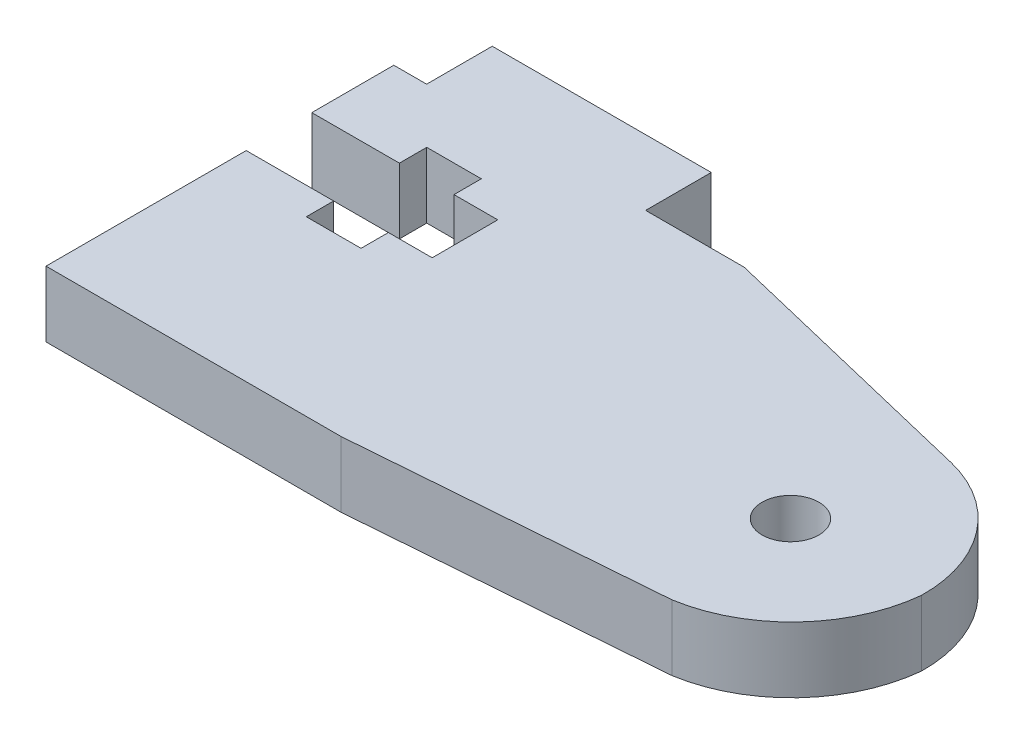
ISO-10303-21;
HEADER;
FILE_DESCRIPTION(('STEP AP214'),'2;1');
FILE_NAME('part.step','',(''),(''),'','','');
FILE_SCHEMA(('AUTOMOTIVE_DESIGN { 1 0 10303 214 1 1 1 1 }'));
ENDSEC;
DATA;
#1=APPLICATION_CONTEXT('core data for automotive mechanical design processes');
#2=APPLICATION_PROTOCOL_DEFINITION('international standard','automotive_design',2000,#1);
#3=PRODUCT_CONTEXT('',#1,'mechanical');
#4=PRODUCT('Part','Part','',(#3));
#5=PRODUCT_RELATED_PRODUCT_CATEGORY('part','',(#4));
#6=PRODUCT_DEFINITION_FORMATION('','',#4);
#7=PRODUCT_DEFINITION_CONTEXT('part definition',#1,'design');
#8=PRODUCT_DEFINITION('design','',#6,#7);
#9=PRODUCT_DEFINITION_SHAPE('','',#8);
#10=(LENGTH_UNIT() NAMED_UNIT(*) SI_UNIT(.MILLI.,.METRE.));
#11=(NAMED_UNIT(*) PLANE_ANGLE_UNIT() SI_UNIT($,.RADIAN.));
#12=(NAMED_UNIT(*) SI_UNIT($,.STERADIAN.) SOLID_ANGLE_UNIT());
#13=UNCERTAINTY_MEASURE_WITH_UNIT(LENGTH_MEASURE(1.E-05),#10,'distance_accuracy_value','');
#14=(GEOMETRIC_REPRESENTATION_CONTEXT(3) GLOBAL_UNCERTAINTY_ASSIGNED_CONTEXT((#13)) GLOBAL_UNIT_ASSIGNED_CONTEXT((#10,
#11,#12)) REPRESENTATION_CONTEXT('',''));
#15=CARTESIAN_POINT('',(0.,0.,0.));
#16=DIRECTION('',(0.,0.,1.));
#17=DIRECTION('',(1.,0.,0.));
#18=AXIS2_PLACEMENT_3D('',#15,#16,#17);
#19=CARTESIAN_POINT('',(237.032159929501,3.,-76.1591165373966));
#20=DIRECTION('',(0.,-1.,0.));
#21=DIRECTION('',(0.,0.,-1.));
#22=AXIS2_PLACEMENT_3D('',#19,#20,#21);
#23=CYLINDRICAL_SURFACE('',#22,5.99997723035679);
#24=CARTESIAN_POINT('',(237.032159929501,0.,-76.1591165373966));
#25=DIRECTION('',(0.,1.,0.));
#26=DIRECTION('',(0.,0.,1.));
#27=AXIS2_PLACEMENT_3D('',#24,#25,#26);
#28=CIRCLE('',#27,5.99997723035679);
#29=CARTESIAN_POINT('',(243.031232266158,0.,-76.0549154608177));
#30=VERTEX_POINT('',#29);
#31=CARTESIAN_POINT('',(238.477244303842,0.,-81.9824710617094));
#32=VERTEX_POINT('',#31);
#33=EDGE_CURVE('E224',#30,#32,#28,.T.);
#34=ORIENTED_EDGE('',*,*,#33,.T.);
#35=DIRECTION('',(0.,-1.,0.));
#36=VECTOR('',#35,1.);
#37=CARTESIAN_POINT('',(238.477244303842,3.,-81.9824710617094));
#38=LINE('',#37,#36);
#39=CARTESIAN_POINT('',(238.477244303842,3.,-81.9824710617094));
#40=VERTEX_POINT('',#39);
#41=EDGE_CURVE('E11',#40,#32,#38,.T.);
#42=ORIENTED_EDGE('',*,*,#41,.F.);
#43=CARTESIAN_POINT('',(237.032159929501,3.,-76.1591165373966));
#44=DIRECTION('',(0.,1.,0.));
#45=DIRECTION('',(0.,0.,1.));
#46=AXIS2_PLACEMENT_3D('',#43,#44,#45);
#47=CIRCLE('',#46,5.99997723035679);
#48=CARTESIAN_POINT('',(243.031232266158,3.,-76.0549154608177));
#49=VERTEX_POINT('',#48);
#50=EDGE_CURVE('E390',#49,#40,#47,.T.);
#51=ORIENTED_EDGE('',*,*,#50,.F.);
#52=DIRECTION('',(0.,-1.,0.));
#53=VECTOR('',#52,1.);
#54=CARTESIAN_POINT('',(243.031232266158,3.,-76.0549154608177));
#55=LINE('',#54,#53);
#56=EDGE_CURVE('E217',#49,#30,#55,.T.);
#57=ORIENTED_EDGE('',*,*,#56,.T.);
#58=EDGE_LOOP('',(#34,#42,#51,#57));
#59=FACE_BOUND('',#58,.T.);
#60=ADVANCED_FACE('F34',(#59),#23,.T.);
#61=CARTESIAN_POINT('',(31.7744189227146,3.,-131.810526193768));
#62=DIRECTION('',(-0.234348403581285,0.,0.972152676146552));
#63=DIRECTION('',(0.972152676146552,0.,0.234348403581285));
#64=AXIS2_PLACEMENT_3D('',#61,#62,#63);
#65=PLANE('',#64);
#66=DIRECTION('',(-0.972152676146552,0.,-0.234348403581285));
#67=VECTOR('',#66,1.);
#68=CARTESIAN_POINT('',(31.7744189227146,0.,-131.810526193768));
#69=LINE('',#68,#67);
#70=CARTESIAN_POINT('',(225.994777469296,0.,-84.9915109452669));
#71=VERTEX_POINT('',#70);
#72=EDGE_CURVE('E227',#32,#71,#69,.T.);
#73=ORIENTED_EDGE('',*,*,#72,.T.);
#74=DIRECTION('',(0.,-1.,0.));
#75=VECTOR('',#74,1.);
#76=CARTESIAN_POINT('',(225.994777469296,3.,-84.9915109452669));
#77=LINE('',#76,#75);
#78=CARTESIAN_POINT('',(225.994777469296,3.,-84.9915109452669));
#79=VERTEX_POINT('',#78);
#80=EDGE_CURVE('E43',#79,#71,#77,.T.);
#81=ORIENTED_EDGE('',*,*,#80,.F.);
#82=DIRECTION('',(-0.972152676146552,0.,-0.234348403581285));
#83=VECTOR('',#82,1.);
#84=CARTESIAN_POINT('',(31.7744189227146,3.,-131.810526193768));
#85=LINE('',#84,#83);
#86=EDGE_CURVE('E139',#40,#79,#85,.T.);
#87=ORIENTED_EDGE('',*,*,#86,.F.);
#88=ORIENTED_EDGE('',*,*,#41,.T.);
#89=EDGE_LOOP('',(#73,#81,#87,#88));
#90=FACE_BOUND('',#89,.T.);
#91=ADVANCED_FACE('F404',(#90),#65,.F.);
#92=CARTESIAN_POINT('',(-0.0667781879876446,3.,-84.8135206798061));
#93=DIRECTION('',(0.000787352850744507,0.,0.999999690037696));
#94=DIRECTION('',(0.999999690037696,0.,-0.000787352850744507));
#95=AXIS2_PLACEMENT_3D('',#92,#93,#94);
#96=PLANE('',#95);
#97=DIRECTION('',(-0.999999690037696,0.,0.000787352850744508));
#98=VECTOR('',#97,1.);
#99=CARTESIAN_POINT('',(-0.0667781879876446,0.,-84.8135206798061));
#100=LINE('',#99,#98);
#101=CARTESIAN_POINT('',(221.494778864127,0.,-84.9879678574386));
#102=VERTEX_POINT('',#101);
#103=EDGE_CURVE('E229',#71,#102,#100,.T.);
#104=ORIENTED_EDGE('',*,*,#103,.T.);
#105=DIRECTION('',(0.,-1.,0.));
#106=VECTOR('',#105,1.);
#107=CARTESIAN_POINT('',(221.494778864127,3.,-84.9879678574386));
#108=LINE('',#107,#106);
#109=CARTESIAN_POINT('',(221.494778864127,3.,-84.9879678574386));
#110=VERTEX_POINT('',#109);
#111=EDGE_CURVE('E320',#110,#102,#108,.T.);
#112=ORIENTED_EDGE('',*,*,#111,.F.);
#113=DIRECTION('',(-0.999999690037696,0.,0.000787352850744508));
#114=VECTOR('',#113,1.);
#115=CARTESIAN_POINT('',(-0.0667781879876446,3.,-84.8135206798061));
#116=LINE('',#115,#114);
#117=EDGE_CURVE('E328',#79,#110,#116,.T.);
#118=ORIENTED_EDGE('',*,*,#117,.F.);
#119=ORIENTED_EDGE('',*,*,#80,.T.);
#120=EDGE_LOOP('',(#104,#112,#118,#119));
#121=FACE_BOUND('',#120,.T.);
#122=ADVANCED_FACE('F326',(#121),#96,.F.);
#123=CARTESIAN_POINT('',(221.56155705212,3.,-0.174447177647875));
#124=DIRECTION('',(-0.999999690037696,0.,0.000787352850814226));
#125=DIRECTION('',(0.000787352850814226,0.,0.999999690037696));
#126=AXIS2_PLACEMENT_3D('',#123,#124,#125);
#127=PLANE('',#126);
#128=DIRECTION('',(-0.000787352850814226,0.,-0.999999690037696));
#129=VECTOR('',#128,1.);
#130=CARTESIAN_POINT('',(221.56155705212,0.,-0.174447177647875));
#131=LINE('',#130,#129);
#132=CARTESIAN_POINT('',(221.492416805574,0.,-87.9879669275564));
#133=VERTEX_POINT('',#132);
#134=EDGE_CURVE('E231',#102,#133,#131,.T.);
#135=ORIENTED_EDGE('',*,*,#134,.T.);
#136=DIRECTION('',(0.,-1.,0.));
#137=VECTOR('',#136,1.);
#138=CARTESIAN_POINT('',(221.492416805574,3.,-87.9879669275564));
#139=LINE('',#138,#137);
#140=CARTESIAN_POINT('',(221.492416805574,3.,-87.9879669275564));
#141=VERTEX_POINT('',#140);
#142=EDGE_CURVE('E318',#141,#133,#139,.T.);
#143=ORIENTED_EDGE('',*,*,#142,.F.);
#144=DIRECTION('',(-0.000787352850814226,0.,-0.999999690037696));
#145=VECTOR('',#144,1.);
#146=CARTESIAN_POINT('',(221.56155705212,3.,-0.174447177647875));
#147=LINE('',#146,#145);
#148=EDGE_CURVE('E339',#110,#141,#147,.T.);
#149=ORIENTED_EDGE('',*,*,#148,.F.);
#150=ORIENTED_EDGE('',*,*,#111,.T.);
#151=EDGE_LOOP('',(#135,#143,#149,#150));
#152=FACE_BOUND('',#151,.T.);
#153=ADVANCED_FACE('F336',(#152),#127,.F.);
#154=CARTESIAN_POINT('',(-0.0691402465457771,3.,-87.8135197499091));
#155=DIRECTION('',(-0.000787352850811774,0.,-0.999999690037696));
#156=DIRECTION('',(-0.999999690037696,0.,0.000787352850811774));
#157=AXIS2_PLACEMENT_3D('',#154,#155,#156);
#158=PLANE('',#157);
#159=DIRECTION('',(0.999999690037696,0.,-0.000787352850811774));
#160=VECTOR('',#159,1.);
#161=CARTESIAN_POINT('',(-0.0691402465457771,0.,-87.8135197499091));
#162=LINE('',#161,#160);
#163=CARTESIAN_POINT('',(211.492419905197,0.,-87.9800933990483));
#164=VERTEX_POINT('',#163);
#165=EDGE_CURVE('E234',#164,#133,#162,.T.);
#166=ORIENTED_EDGE('',*,*,#165,.F.);
#167=DIRECTION('',(0.,-1.,0.));
#168=VECTOR('',#167,1.);
#169=CARTESIAN_POINT('',(211.492419905197,3.,-87.9800933990483));
#170=LINE('',#169,#168);
#171=CARTESIAN_POINT('',(211.492419905197,3.,-87.9800933990483));
#172=VERTEX_POINT('',#171);
#173=EDGE_CURVE('E316',#172,#164,#170,.T.);
#174=ORIENTED_EDGE('',*,*,#173,.F.);
#175=DIRECTION('',(0.999999690037696,0.,-0.000787352850811774));
#176=VECTOR('',#175,1.);
#177=CARTESIAN_POINT('',(-0.0691402465457771,3.,-87.8135197499091));
#178=LINE('',#177,#176);
#179=EDGE_CURVE('E341',#172,#141,#178,.T.);
#180=ORIENTED_EDGE('',*,*,#179,.T.);
#181=ORIENTED_EDGE('',*,*,#142,.T.);
#182=EDGE_LOOP('',(#166,#174,#180,#181));
#183=FACE_BOUND('',#182,.T.);
#184=ADVANCED_FACE('F414',(#183),#158,.T.);
#185=CARTESIAN_POINT('',(211.561560151742,3.,-0.166573649136079));
#186=DIRECTION('',(-0.999999690037696,0.,0.000787352850796964));
#187=DIRECTION('',(0.000787352850796964,0.,0.999999690037696));
#188=AXIS2_PLACEMENT_3D('',#185,#186,#187);
#189=PLANE('',#188);
#190=DIRECTION('',(-0.000787352850796964,0.,-0.999999690037696));
#191=VECTOR('',#190,1.);
#192=CARTESIAN_POINT('',(211.561560151742,0.,-0.166573649136079));
#193=LINE('',#192,#191);
#194=CARTESIAN_POINT('',(211.49478196375,0.,-84.9800943289352));
#195=VERTEX_POINT('',#194);
#196=EDGE_CURVE('E237',#195,#164,#193,.T.);
#197=ORIENTED_EDGE('',*,*,#196,.F.);
#198=DIRECTION('',(0.,-1.,0.));
#199=VECTOR('',#198,1.);
#200=CARTESIAN_POINT('',(211.49478196375,3.,-84.9800943289352));
#201=LINE('',#200,#199);
#202=CARTESIAN_POINT('',(211.49478196375,3.,-84.9800943289352));
#203=VERTEX_POINT('',#202);
#204=EDGE_CURVE('E314',#203,#195,#201,.T.);
#205=ORIENTED_EDGE('',*,*,#204,.F.);
#206=DIRECTION('',(-0.000787352850796964,0.,-0.999999690037696));
#207=VECTOR('',#206,1.);
#208=CARTESIAN_POINT('',(211.561560151742,3.,-0.166573649136079));
#209=LINE('',#208,#207);
#210=EDGE_CURVE('E343',#203,#172,#209,.T.);
#211=ORIENTED_EDGE('',*,*,#210,.T.);
#212=ORIENTED_EDGE('',*,*,#173,.T.);
#213=EDGE_LOOP('',(#197,#205,#211,#212));
#214=FACE_BOUND('',#213,.T.);
#215=ADVANCED_FACE('F417',(#214),#189,.T.);
#216=CARTESIAN_POINT('',(-0.0667781879892872,3.,-84.8135206798061));
#217=DIRECTION('',(-0.000787352850763875,0.,-0.999999690037696));
#218=DIRECTION('',(-0.999999690037696,0.,0.000787352850763875));
#219=AXIS2_PLACEMENT_3D('',#216,#217,#218);
#220=PLANE('',#219);
#221=DIRECTION('',(0.999999690037696,0.,-0.000787352850763875));
#222=VECTOR('',#221,1.);
#223=CARTESIAN_POINT('',(-0.0667781879892872,0.,-84.8135206798061));
#224=LINE('',#223,#222);
#225=CARTESIAN_POINT('',(209.9947824287,0.,-84.978913299659));
#226=VERTEX_POINT('',#225);
#227=EDGE_CURVE('E240',#226,#195,#224,.T.);
#228=ORIENTED_EDGE('',*,*,#227,.F.);
#229=DIRECTION('',(0.,-1.,0.));
#230=VECTOR('',#229,1.);
#231=CARTESIAN_POINT('',(209.9947824287,3.,-84.978913299659));
#232=LINE('',#231,#230);
#233=CARTESIAN_POINT('',(209.9947824287,3.,-84.978913299659));
#234=VERTEX_POINT('',#233);
#235=EDGE_CURVE('E312',#234,#226,#232,.T.);
#236=ORIENTED_EDGE('',*,*,#235,.F.);
#237=DIRECTION('',(0.999999690037696,0.,-0.000787352850763875));
#238=VECTOR('',#237,1.);
#239=CARTESIAN_POINT('',(-0.0667781879892872,3.,-84.8135206798061));
#240=LINE('',#239,#238);
#241=EDGE_CURVE('E350',#234,#203,#240,.T.);
#242=ORIENTED_EDGE('',*,*,#241,.T.);
#243=ORIENTED_EDGE('',*,*,#204,.T.);
#244=EDGE_LOOP('',(#228,#236,#242,#243));
#245=FACE_BOUND('',#244,.T.);
#246=ADVANCED_FACE('F421',(#245),#220,.T.);
#247=CARTESIAN_POINT('',(210.06180547931,3.,-0.166000465605313));
#248=DIRECTION('',(-0.999999687755911,0.,0.000790245582217463));
#249=DIRECTION('',(0.000790245582217463,0.,0.999999687755911));
#250=AXIS2_PLACEMENT_3D('',#247,#248,#249);
#251=PLANE('',#250);
#252=DIRECTION('',(-0.000790245582217463,0.,-0.999999687755911));
#253=VECTOR('',#252,1.);
#254=CARTESIAN_POINT('',(210.06180547931,0.,-0.166000465605313));
#255=LINE('',#254,#253);
#256=CARTESIAN_POINT('',(209.997745798409,0.,-81.2289792923177));
#257=VERTEX_POINT('',#256);
#258=EDGE_CURVE('E243',#257,#226,#255,.T.);
#259=ORIENTED_EDGE('',*,*,#258,.F.);
#260=DIRECTION('',(0.,-1.,0.));
#261=VECTOR('',#260,1.);
#262=CARTESIAN_POINT('',(209.997745798409,3.,-81.2289792923177));
#263=LINE('',#262,#261);
#264=CARTESIAN_POINT('',(209.997745798409,3.,-81.2289792923177));
#265=VERTEX_POINT('',#264);
#266=EDGE_CURVE('E310',#265,#257,#263,.T.);
#267=ORIENTED_EDGE('',*,*,#266,.F.);
#268=DIRECTION('',(-0.000790245582217463,0.,-0.999999687755911));
#269=VECTOR('',#268,1.);
#270=CARTESIAN_POINT('',(210.06180547931,3.,-0.166000465605313));
#271=LINE('',#270,#269);
#272=EDGE_CURVE('E353',#265,#234,#271,.T.);
#273=ORIENTED_EDGE('',*,*,#272,.T.);
#274=ORIENTED_EDGE('',*,*,#235,.T.);
#275=EDGE_LOOP('',(#259,#267,#273,#274));
#276=FACE_BOUND('',#275,.T.);
#277=ADVANCED_FACE('F425',(#276),#251,.T.);
#278=CARTESIAN_POINT('',(-0.063825665838254,3.,-81.0635866639194));
#279=DIRECTION('',(-0.00078735285078512,0.,-0.999999690037696));
#280=DIRECTION('',(-0.999999690037696,0.,0.00078735285078512));
#281=AXIS2_PLACEMENT_3D('',#278,#279,#280);
#282=PLANE('',#281);
#283=DIRECTION('',(0.999999690037696,0.,-0.00078735285078512));
#284=VECTOR('',#283,1.);
#285=CARTESIAN_POINT('',(-0.063825665838254,0.,-81.0635866639194));
#286=LINE('',#285,#284);
#287=CARTESIAN_POINT('',(213.997733687767,0.,-81.2321286951617));
#288=VERTEX_POINT('',#287);
#289=EDGE_CURVE('E246',#257,#288,#286,.T.);
#290=ORIENTED_EDGE('',*,*,#289,.T.);
#291=DIRECTION('',(0.,-1.,0.));
#292=VECTOR('',#291,1.);
#293=CARTESIAN_POINT('',(213.997733687767,3.,-81.2321286951617));
#294=LINE('',#293,#292);
#295=CARTESIAN_POINT('',(213.997733687767,3.,-81.2321286951617));
#296=VERTEX_POINT('',#295);
#297=EDGE_CURVE('E307',#296,#288,#294,.T.);
#298=ORIENTED_EDGE('',*,*,#297,.F.);
#299=DIRECTION('',(0.999999690037696,0.,-0.00078735285078512));
#300=VECTOR('',#299,1.);
#301=CARTESIAN_POINT('',(-0.063825665838254,3.,-81.0635866639194));
#302=LINE('',#301,#300);
#303=EDGE_CURVE('E356',#265,#296,#302,.T.);
#304=ORIENTED_EDGE('',*,*,#303,.F.);
#305=ORIENTED_EDGE('',*,*,#266,.T.);
#306=EDGE_LOOP('',(#290,#298,#304,#305));
#307=FACE_BOUND('',#306,.T.);
#308=ADVANCED_FACE('F429',(#307),#282,.F.);
#309=CARTESIAN_POINT('',(214.0615593536,3.,-0.168542031227749));
#310=DIRECTION('',(-0.999999690037696,0.,0.000787352850717418));
#311=DIRECTION('',(0.000787352850717418,0.,0.999999690037696));
#312=AXIS2_PLACEMENT_3D('',#309,#310,#311);
#313=PLANE('',#312);
#314=DIRECTION('',(-0.000787352850717418,0.,-0.999999690037696));
#315=VECTOR('',#314,1.);
#316=CARTESIAN_POINT('',(214.0615593536,0.,-0.168542031227749));
#317=LINE('',#316,#315);
#318=CARTESIAN_POINT('',(213.996749496703,0.,-82.4821283077088));
#319=VERTEX_POINT('',#318);
#320=EDGE_CURVE('E248',#288,#319,#317,.T.);
#321=ORIENTED_EDGE('',*,*,#320,.T.);
#322=DIRECTION('',(0.,-1.,0.));
#323=VECTOR('',#322,1.);
#324=CARTESIAN_POINT('',(213.996749496703,3.,-82.4821283077088));
#325=LINE('',#324,#323);
#326=CARTESIAN_POINT('',(213.996749496703,3.,-82.4821283077088));
#327=VERTEX_POINT('',#326);
#328=EDGE_CURVE('E304',#327,#319,#325,.T.);
#329=ORIENTED_EDGE('',*,*,#328,.F.);
#330=DIRECTION('',(-0.000787352850717418,0.,-0.999999690037696));
#331=VECTOR('',#330,1.);
#332=CARTESIAN_POINT('',(214.0615593536,3.,-0.168542031227749));
#333=LINE('',#332,#331);
#334=EDGE_CURVE('E358',#296,#327,#333,.T.);
#335=ORIENTED_EDGE('',*,*,#334,.F.);
#336=ORIENTED_EDGE('',*,*,#297,.T.);
#337=EDGE_LOOP('',(#321,#329,#335,#336));
#338=FACE_BOUND('',#337,.T.);
#339=ADVANCED_FACE('F433',(#338),#313,.F.);
#340=CARTESIAN_POINT('',(-0.0648098569019996,3.,-82.3135862764658));
#341=DIRECTION('',(-0.000787352850788336,0.,-0.999999690037696));
#342=DIRECTION('',(-0.999999690037696,0.,0.000787352850788336));
#343=AXIS2_PLACEMENT_3D('',#340,#341,#342);
#344=PLANE('',#343);
#345=DIRECTION('',(0.999999690037696,0.,-0.000787352850788337));
#346=VECTOR('',#345,1.);
#347=CARTESIAN_POINT('',(-0.0648098569019996,0.,-82.3135862764658));
#348=LINE('',#347,#346);
#349=CARTESIAN_POINT('',(216.489286694099,0.,-82.4840908145851));
#350=VERTEX_POINT('',#349);
#351=EDGE_CURVE('E250',#319,#350,#348,.T.);
#352=ORIENTED_EDGE('',*,*,#351,.T.);
#353=DIRECTION('',(0.,-1.,0.));
#354=VECTOR('',#353,1.);
#355=CARTESIAN_POINT('',(216.489286694099,3.,-82.4840908145851));
#356=LINE('',#355,#354);
#357=CARTESIAN_POINT('',(216.489286694099,3.,-82.4840908145851));
#358=VERTEX_POINT('',#357);
#359=EDGE_CURVE('E301',#358,#350,#356,.T.);
#360=ORIENTED_EDGE('',*,*,#359,.F.);
#361=DIRECTION('',(0.999999690037696,0.,-0.000787352850788337));
#362=VECTOR('',#361,1.);
#363=CARTESIAN_POINT('',(-0.0648098569019996,3.,-82.3135862764658));
#364=LINE('',#363,#362);
#365=EDGE_CURVE('E360',#327,#358,#364,.T.);
#366=ORIENTED_EDGE('',*,*,#365,.F.);
#367=ORIENTED_EDGE('',*,*,#328,.T.);
#368=EDGE_LOOP('',(#352,#360,#366,#367));
#369=FACE_BOUND('',#368,.T.);
#370=ADVANCED_FACE('F437',(#369),#344,.F.);
#371=CARTESIAN_POINT('',(216.554096550997,3.,-0.170504538108773));
#372=DIRECTION('',(0.999999690037696,0.,-0.000787352850739728));
#373=DIRECTION('',(-0.000787352850739728,0.,-0.999999690037696));
#374=AXIS2_PLACEMENT_3D('',#371,#372,#373);
#375=PLANE('',#374);
#376=DIRECTION('',(0.000787352850739728,0.,0.999999690037696));
#377=VECTOR('',#376,1.);
#378=CARTESIAN_POINT('',(216.554096550997,0.,-0.170504538108773));
#379=LINE('',#378,#377);
#380=CARTESIAN_POINT('',(216.490270885162,0.,-81.2340912020382));
#381=VERTEX_POINT('',#380);
#382=EDGE_CURVE('E252',#350,#381,#379,.T.);
#383=ORIENTED_EDGE('',*,*,#382,.T.);
#384=DIRECTION('',(0.,-1.,0.));
#385=VECTOR('',#384,1.);
#386=CARTESIAN_POINT('',(216.490270885162,3.,-81.2340912020382));
#387=LINE('',#386,#385);
#388=CARTESIAN_POINT('',(216.490270885162,3.,-81.2340912020382));
#389=VERTEX_POINT('',#388);
#390=EDGE_CURVE('E298',#389,#381,#387,.T.);
#391=ORIENTED_EDGE('',*,*,#390,.F.);
#392=DIRECTION('',(0.000787352850739728,0.,0.999999690037696));
#393=VECTOR('',#392,1.);
#394=CARTESIAN_POINT('',(216.554096550997,3.,-0.170504538108773));
#395=LINE('',#394,#393);
#396=EDGE_CURVE('E362',#358,#389,#395,.T.);
#397=ORIENTED_EDGE('',*,*,#396,.F.);
#398=ORIENTED_EDGE('',*,*,#359,.T.);
#399=EDGE_LOOP('',(#383,#391,#397,#398));
#400=FACE_BOUND('',#399,.T.);
#401=ADVANCED_FACE('F441',(#400),#375,.F.);
#402=CARTESIAN_POINT('',(-0.0638256658427722,3.,-81.0635866639075));
#403=DIRECTION('',(-0.000787352850840972,0.,-0.999999690037696));
#404=DIRECTION('',(-0.999999690037696,0.,0.000787352850840972));
#405=AXIS2_PLACEMENT_3D('',#402,#403,#404);
#406=PLANE('',#405);
#407=DIRECTION('',(0.999999690037696,0.,-0.000787352850840972));
#408=VECTOR('',#407,1.);
#409=CARTESIAN_POINT('',(-0.0638256658427722,0.,-81.0635866639075));
#410=LINE('',#409,#408);
#411=CARTESIAN_POINT('',(218.490270265238,0.,-81.2356659077399));
#412=VERTEX_POINT('',#411);
#413=EDGE_CURVE('E254',#381,#412,#410,.T.);
#414=ORIENTED_EDGE('',*,*,#413,.T.);
#415=DIRECTION('',(0.,-1.,0.));
#416=VECTOR('',#415,1.);
#417=CARTESIAN_POINT('',(218.490270265238,3.,-81.2356659077399));
#418=LINE('',#417,#416);
#419=CARTESIAN_POINT('',(218.490270265238,3.,-81.2356659077399));
#420=VERTEX_POINT('',#419);
#421=EDGE_CURVE('E295',#420,#412,#418,.T.);
#422=ORIENTED_EDGE('',*,*,#421,.F.);
#423=DIRECTION('',(0.999999690037696,0.,-0.000787352850840972));
#424=VECTOR('',#423,1.);
#425=CARTESIAN_POINT('',(-0.0638256658427722,3.,-81.0635866639075));
#426=LINE('',#425,#424);
#427=EDGE_CURVE('E364',#389,#420,#426,.T.);
#428=ORIENTED_EDGE('',*,*,#427,.F.);
#429=ORIENTED_EDGE('',*,*,#390,.T.);
#430=EDGE_LOOP('',(#414,#422,#428,#429));
#431=FACE_BOUND('',#430,.T.);
#432=ADVANCED_FACE('F445',(#431),#406,.F.);
#433=CARTESIAN_POINT('',(218.554095931081,3.,-0.172079243832883));
#434=DIRECTION('',(0.999999690037696,0.,-0.000787352850843245));
#435=DIRECTION('',(-0.000787352850843245,0.,-0.999999690037696));
#436=AXIS2_PLACEMENT_3D('',#433,#434,#435);
#437=PLANE('',#436);
#438=DIRECTION('',(0.000787352850843245,0.,0.999999690037696));
#439=VECTOR('',#438,1.);
#440=CARTESIAN_POINT('',(218.554095931081,0.,-0.172079243832883));
#441=LINE('',#440,#439);
#442=CARTESIAN_POINT('',(218.49263232379,0.,-78.2356668376269));
#443=VERTEX_POINT('',#442);
#444=EDGE_CURVE('E256',#412,#443,#441,.T.);
#445=ORIENTED_EDGE('',*,*,#444,.T.);
#446=DIRECTION('',(0.,-1.,0.));
#447=VECTOR('',#446,1.);
#448=CARTESIAN_POINT('',(218.49263232379,3.,-78.2356668376269));
#449=LINE('',#448,#447);
#450=CARTESIAN_POINT('',(218.49263232379,3.,-78.2356668376269));
#451=VERTEX_POINT('',#450);
#452=EDGE_CURVE('E292',#451,#443,#449,.T.);
#453=ORIENTED_EDGE('',*,*,#452,.F.);
#454=DIRECTION('',(0.000787352850843245,0.,0.999999690037696));
#455=VECTOR('',#454,1.);
#456=CARTESIAN_POINT('',(218.554095931081,3.,-0.172079243832883));
#457=LINE('',#456,#455);
#458=EDGE_CURVE('E366',#420,#451,#457,.T.);
#459=ORIENTED_EDGE('',*,*,#458,.F.);
#460=ORIENTED_EDGE('',*,*,#421,.T.);
#461=EDGE_LOOP('',(#445,#453,#459,#460));
#462=FACE_BOUND('',#461,.T.);
#463=ADVANCED_FACE('F449',(#462),#437,.F.);
#464=CARTESIAN_POINT('',(-0.0614636072880798,3.,-78.0635875938006));
#465=DIRECTION('',(0.000787352850813118,0.,0.999999690037696));
#466=DIRECTION('',(0.999999690037696,0.,-0.000787352850813118));
#467=AXIS2_PLACEMENT_3D('',#464,#465,#466);
#468=PLANE('',#467);
#469=DIRECTION('',(-0.999999690037696,0.,0.000787352850813118));
#470=VECTOR('',#469,1.);
#471=CARTESIAN_POINT('',(-0.0614636072880798,0.,-78.0635875938006));
#472=LINE('',#471,#470);
#473=CARTESIAN_POINT('',(216.492632943715,0.,-78.2340921319252));
#474=VERTEX_POINT('',#473);
#475=EDGE_CURVE('E258',#443,#474,#472,.T.);
#476=ORIENTED_EDGE('',*,*,#475,.T.);
#477=DIRECTION('',(0.,-1.,0.));
#478=VECTOR('',#477,1.);
#479=CARTESIAN_POINT('',(216.492632943715,3.,-78.2340921319252));
#480=LINE('',#479,#478);
#481=CARTESIAN_POINT('',(216.492632943715,3.,-78.2340921319252));
#482=VERTEX_POINT('',#481);
#483=EDGE_CURVE('E289',#482,#474,#480,.T.);
#484=ORIENTED_EDGE('',*,*,#483,.F.);
#485=DIRECTION('',(-0.999999690037696,0.,0.000787352850813118));
#486=VECTOR('',#485,1.);
#487=CARTESIAN_POINT('',(-0.0614636072880798,3.,-78.0635875938006));
#488=LINE('',#487,#486);
#489=EDGE_CURVE('E368',#451,#482,#488,.T.);
#490=ORIENTED_EDGE('',*,*,#489,.F.);
#491=ORIENTED_EDGE('',*,*,#452,.T.);
#492=EDGE_LOOP('',(#476,#484,#490,#491));
#493=FACE_BOUND('',#492,.T.);
#494=ADVANCED_FACE('F453',(#493),#468,.F.);
#495=CARTESIAN_POINT('',(216.554096551002,3.,-0.170504538123165));
#496=DIRECTION('',(0.999999690037696,0.,-0.000787352850806166));
#497=DIRECTION('',(-0.000787352850806166,0.,-0.999999690037696));
#498=AXIS2_PLACEMENT_3D('',#495,#496,#497);
#499=PLANE('',#498);
#500=DIRECTION('',(0.000787352850806166,0.,0.999999690037696));
#501=VECTOR('',#500,1.);
#502=CARTESIAN_POINT('',(216.554096551002,0.,-0.170504538123165));
#503=LINE('',#502,#501);
#504=CARTESIAN_POINT('',(216.493617134778,0.,-76.984092519378));
#505=VERTEX_POINT('',#504);
#506=EDGE_CURVE('E260',#474,#505,#503,.T.);
#507=ORIENTED_EDGE('',*,*,#506,.T.);
#508=DIRECTION('',(0.,-1.,0.));
#509=VECTOR('',#508,1.);
#510=CARTESIAN_POINT('',(216.493617134778,3.,-76.984092519378));
#511=LINE('',#510,#509);
#512=CARTESIAN_POINT('',(216.493617134778,3.,-76.984092519378));
#513=VERTEX_POINT('',#512);
#514=EDGE_CURVE('E286',#513,#505,#511,.T.);
#515=ORIENTED_EDGE('',*,*,#514,.F.);
#516=DIRECTION('',(0.000787352850806166,0.,0.999999690037696));
#517=VECTOR('',#516,1.);
#518=CARTESIAN_POINT('',(216.554096551002,3.,-0.170504538123165));
#519=LINE('',#518,#517);
#520=EDGE_CURVE('E370',#482,#513,#519,.T.);
#521=ORIENTED_EDGE('',*,*,#520,.F.);
#522=ORIENTED_EDGE('',*,*,#483,.T.);
#523=EDGE_LOOP('',(#507,#515,#521,#522));
#524=FACE_BOUND('',#523,.T.);
#525=ADVANCED_FACE('F457',(#524),#499,.F.);
#526=CARTESIAN_POINT('',(-0.0604794162236077,3.,-76.813587981256));
#527=DIRECTION('',(0.00078735285080065,0.,0.999999690037696));
#528=DIRECTION('',(0.999999690037696,0.,-0.00078735285080065));
#529=AXIS2_PLACEMENT_3D('',#526,#527,#528);
#530=PLANE('',#529);
#531=DIRECTION('',(-0.999999690037696,0.,0.00078735285080065));
#532=VECTOR('',#531,1.);
#533=CARTESIAN_POINT('',(-0.0604794162236077,0.,-76.813587981256));
#534=LINE('',#533,#532);
#535=CARTESIAN_POINT('',(213.993617909684,0.,-76.982124137251));
#536=VERTEX_POINT('',#535);
#537=EDGE_CURVE('E262',#505,#536,#534,.T.);
#538=ORIENTED_EDGE('',*,*,#537,.T.);
#539=DIRECTION('',(0.,-1.,0.));
#540=VECTOR('',#539,1.);
#541=CARTESIAN_POINT('',(213.993617909684,3.,-76.982124137251));
#542=LINE('',#541,#540);
#543=CARTESIAN_POINT('',(213.993617909684,3.,-76.982124137251));
#544=VERTEX_POINT('',#543);
#545=EDGE_CURVE('E283',#544,#536,#542,.T.);
#546=ORIENTED_EDGE('',*,*,#545,.F.);
#547=DIRECTION('',(-0.999999690037696,0.,0.00078735285080065));
#548=VECTOR('',#547,1.);
#549=CARTESIAN_POINT('',(-0.0604794162236077,3.,-76.813587981256));
#550=LINE('',#549,#548);
#551=EDGE_CURVE('E372',#513,#544,#550,.T.);
#552=ORIENTED_EDGE('',*,*,#551,.F.);
#553=ORIENTED_EDGE('',*,*,#514,.T.);
#554=EDGE_LOOP('',(#538,#546,#552,#553));
#555=FACE_BOUND('',#554,.T.);
#556=ADVANCED_FACE('F461',(#555),#530,.F.);
#557=CARTESIAN_POINT('',(214.054097325906,3.,-0.168536155991401));
#558=DIRECTION('',(-0.999999690037696,0.,0.000787352850783988));
#559=DIRECTION('',(0.000787352850783988,0.,0.999999690037696));
#560=AXIS2_PLACEMENT_3D('',#557,#558,#559);
#561=PLANE('',#560);
#562=DIRECTION('',(-0.000787352850783988,0.,-0.999999690037696));
#563=VECTOR('',#562,1.);
#564=CARTESIAN_POINT('',(214.054097325906,0.,-0.168536155991401));
#565=LINE('',#564,#563);
#566=CARTESIAN_POINT('',(213.99263371862,0.,-78.2321237497982));
#567=VERTEX_POINT('',#566);
#568=EDGE_CURVE('E264',#536,#567,#565,.T.);
#569=ORIENTED_EDGE('',*,*,#568,.T.);
#570=DIRECTION('',(0.,-1.,0.));
#571=VECTOR('',#570,1.);
#572=CARTESIAN_POINT('',(213.99263371862,3.,-78.2321237497982));
#573=LINE('',#572,#571);
#574=CARTESIAN_POINT('',(213.99263371862,3.,-78.2321237497982));
#575=VERTEX_POINT('',#574);
#576=EDGE_CURVE('E280',#575,#567,#573,.T.);
#577=ORIENTED_EDGE('',*,*,#576,.F.);
#578=DIRECTION('',(-0.000787352850783988,0.,-0.999999690037696));
#579=VECTOR('',#578,1.);
#580=CARTESIAN_POINT('',(214.054097325906,3.,-0.168536155991401));
#581=LINE('',#580,#579);
#582=EDGE_CURVE('E374',#544,#575,#581,.T.);
#583=ORIENTED_EDGE('',*,*,#582,.F.);
#584=ORIENTED_EDGE('',*,*,#545,.T.);
#585=EDGE_LOOP('',(#569,#577,#583,#584));
#586=FACE_BOUND('',#585,.T.);
#587=ADVANCED_FACE('F465',(#586),#561,.F.);
#588=CARTESIAN_POINT('',(-0.0614636073853601,3.,-78.0635875935332));
#589=DIRECTION('',(0.000787352852061982,0.,0.999999690037695));
#590=DIRECTION('',(0.999999690037695,0.,-0.000787352852061982));
#591=AXIS2_PLACEMENT_3D('',#588,#589,#590);
#592=PLANE('',#591);
#593=DIRECTION('',(-0.999999690037695,0.,0.000787352852061982));
#594=VECTOR('',#593,1.);
#595=CARTESIAN_POINT('',(-0.0614636073853601,0.,-78.0635875935332));
#596=LINE('',#595,#594);
#597=CARTESIAN_POINT('',(210.000112684434,0.,-78.2289802260006));
#598=VERTEX_POINT('',#597);
#599=EDGE_CURVE('E266',#567,#598,#596,.T.);
#600=ORIENTED_EDGE('',*,*,#599,.T.);
#601=DIRECTION('',(0.,-1.,0.));
#602=VECTOR('',#601,1.);
#603=CARTESIAN_POINT('',(210.000112684434,3.,-78.2289802260006));
#604=LINE('',#603,#602);
#605=CARTESIAN_POINT('',(210.000112684434,3.,-78.2289802260006));
#606=VERTEX_POINT('',#605);
#607=EDGE_CURVE('E277',#606,#598,#604,.T.);
#608=ORIENTED_EDGE('',*,*,#607,.F.);
#609=DIRECTION('',(-0.999999690037695,0.,0.000787352852061982));
#610=VECTOR('',#609,1.);
#611=CARTESIAN_POINT('',(-0.0614636073853601,3.,-78.0635875935332));
#612=LINE('',#611,#610);
#613=EDGE_CURVE('E376',#575,#606,#612,.T.);
#614=ORIENTED_EDGE('',*,*,#613,.F.);
#615=ORIENTED_EDGE('',*,*,#576,.T.);
#616=EDGE_LOOP('',(#600,#608,#614,#615));
#617=FACE_BOUND('',#616,.T.);
#618=ADVANCED_FACE('F382',(#617),#592,.F.);
#619=CARTESIAN_POINT('',(209.998011827633,3.,0.0056391371851005));
#620=DIRECTION('',(0.99999999963945,0.,2.68532884382539E-05));
#621=DIRECTION('',(2.6853288438254E-05,0.,-0.999999999639451));
#622=AXIS2_PLACEMENT_3D('',#619,#620,#621);
#623=PLANE('',#622);
#624=DIRECTION('',(-2.6853288438254E-05,0.,0.999999999639451));
#625=VECTOR('',#624,1.);
#626=CARTESIAN_POINT('',(209.998011827633,0.,0.0056391371851005));
#627=LINE('',#626,#625);
#628=CARTESIAN_POINT('',(209.999867004229,0.,-69.0800000000001));
#629=VERTEX_POINT('',#628);
#630=EDGE_CURVE('E268',#598,#629,#627,.T.);
#631=ORIENTED_EDGE('',*,*,#630,.T.);
#632=DIRECTION('',(0.,-1.,0.));
#633=VECTOR('',#632,1.);
#634=CARTESIAN_POINT('',(209.999867004229,3.,-69.0800000000001));
#635=LINE('',#634,#633);
#636=CARTESIAN_POINT('',(209.999867004229,3.,-69.0800000000001));
#637=VERTEX_POINT('',#636);
#638=EDGE_CURVE('E212',#637,#629,#635,.T.);
#639=ORIENTED_EDGE('',*,*,#638,.F.);
#640=DIRECTION('',(-2.6853288438254E-05,0.,0.999999999639451));
#641=VECTOR('',#640,1.);
#642=CARTESIAN_POINT('',(209.998011827633,3.,0.0056391371851005));
#643=LINE('',#642,#641);
#644=EDGE_CURVE('E203',#606,#637,#643,.T.);
#645=ORIENTED_EDGE('',*,*,#644,.F.);
#646=ORIENTED_EDGE('',*,*,#607,.T.);
#647=EDGE_LOOP('',(#631,#639,#645,#646));
#648=FACE_BOUND('',#647,.T.);
#649=ADVANCED_FACE('F386',(#648),#623,.F.);
#650=CARTESIAN_POINT('',(0.,3.,-69.0800000000001));
#651=DIRECTION('',(0.,0.,-1.));
#652=DIRECTION('',(-1.,0.,0.));
#653=AXIS2_PLACEMENT_3D('',#650,#651,#652);
#654=PLANE('',#653);
#655=DIRECTION('',(1.,0.,0.));
#656=VECTOR('',#655,1.);
#657=CARTESIAN_POINT('',(0.,0.,-69.0800000000001));
#658=LINE('',#657,#656);
#659=CARTESIAN_POINT('',(223.4882426402,0.,-69.0800000000001));
#660=VERTEX_POINT('',#659);
#661=EDGE_CURVE('E211',#629,#660,#658,.T.);
#662=ORIENTED_EDGE('',*,*,#661,.T.);
#663=DIRECTION('',(0.,-1.,0.));
#664=VECTOR('',#663,1.);
#665=CARTESIAN_POINT('',(223.4882426402,3.,-69.0800000000001));
#666=LINE('',#665,#664);
#667=CARTESIAN_POINT('',(223.4882426402,3.,-69.0800000000001));
#668=VERTEX_POINT('',#667);
#669=EDGE_CURVE('E208',#668,#660,#666,.T.);
#670=ORIENTED_EDGE('',*,*,#669,.F.);
#671=DIRECTION('',(1.,0.,0.));
#672=VECTOR('',#671,1.);
#673=CARTESIAN_POINT('',(0.,3.,-69.0800000000001));
#674=LINE('',#673,#672);
#675=EDGE_CURVE('E197',#637,#668,#674,.T.);
#676=ORIENTED_EDGE('',*,*,#675,.F.);
#677=ORIENTED_EDGE('',*,*,#638,.T.);
#678=EDGE_LOOP('',(#662,#670,#676,#677));
#679=FACE_BOUND('',#678,.T.);
#680=ADVANCED_FACE('F209',(#679),#654,.F.);
#681=CARTESIAN_POINT('',(-4.01480532809525,3.,-51.2621754224437));
#682=DIRECTION('',(-0.0780799584819267,0.,-0.996947099942349));
#683=DIRECTION('',(-0.996947099942349,0.,0.0780799584819267));
#684=AXIS2_PLACEMENT_3D('',#681,#682,#683);
#685=PLANE('',#684);
#686=DIRECTION('',(0.996947099942349,0.,-0.0780799584819267));
#687=VECTOR('',#686,1.);
#688=CARTESIAN_POINT('',(-4.01480532809525,0.,-51.2621754224437));
#689=LINE('',#688,#687);
#690=CARTESIAN_POINT('',(237.517934203416,0.,-70.1787922376559));
#691=VERTEX_POINT('',#690);
#692=EDGE_CURVE('E125',#660,#691,#689,.T.);
#693=ORIENTED_EDGE('',*,*,#692,.T.);
#694=DIRECTION('',(0.,-1.,0.));
#695=VECTOR('',#694,1.);
#696=CARTESIAN_POINT('',(237.517934203416,3.,-70.1787922376559));
#697=LINE('',#696,#695);
#698=CARTESIAN_POINT('',(237.517934203416,3.,-70.1787922376559));
#699=VERTEX_POINT('',#698);
#700=EDGE_CURVE('E213',#699,#691,#697,.T.);
#701=ORIENTED_EDGE('',*,*,#700,.F.);
#702=DIRECTION('',(0.996947099942349,0.,-0.0780799584819267));
#703=VECTOR('',#702,1.);
#704=CARTESIAN_POINT('',(-4.01480532809525,3.,-51.2621754224437));
#705=LINE('',#704,#703);
#706=EDGE_CURVE('E201',#668,#699,#705,.T.);
#707=ORIENTED_EDGE('',*,*,#706,.F.);
#708=ORIENTED_EDGE('',*,*,#669,.T.);
#709=EDGE_LOOP('',(#693,#701,#707,#708));
#710=FACE_BOUND('',#709,.T.);
#711=ADVANCED_FACE('F215',(#710),#685,.F.);
#712=CARTESIAN_POINT('',(237.001781500083,3.,-76.1001745852953));
#713=DIRECTION('',(0.,-1.,0.));
#714=DIRECTION('',(0.,0.,-1.));
#715=AXIS2_PLACEMENT_3D('',#712,#713,#714);
#716=CYLINDRICAL_SURFACE('',#715,1.30000000000001);
#717=CARTESIAN_POINT('',(237.001781500083,3.,-76.1001745852953));
#718=DIRECTION('',(0.,1.,0.));
#719=DIRECTION('',(0.,0.,1.));
#720=AXIS2_PLACEMENT_3D('',#717,#718,#719);
#721=CIRCLE('',#720,1.30000000000001);
#722=CARTESIAN_POINT('',(237.001781500083,3.,-74.8001745852953));
#723=VERTEX_POINT('',#722);
#724=EDGE_CURVE('E273',#723,#723,#721,.T.);
#725=ORIENTED_EDGE('',*,*,#724,.T.);
#726=EDGE_LOOP('',(#725));
#727=FACE_BOUND('',#726,.T.);
#728=CARTESIAN_POINT('',(237.001781500083,0.,-76.1001745852953));
#729=DIRECTION('',(0.,1.,0.));
#730=DIRECTION('',(0.,0.,1.));
#731=AXIS2_PLACEMENT_3D('',#728,#729,#730);
#732=CIRCLE('',#731,1.30000000000001);
#733=CARTESIAN_POINT('',(237.001781500083,0.,-74.8001745852953));
#734=VERTEX_POINT('',#733);
#735=EDGE_CURVE('E221',#734,#734,#732,.T.);
#736=ORIENTED_EDGE('',*,*,#735,.F.);
#737=EDGE_LOOP('',(#736));
#738=FACE_BOUND('',#737,.T.);
#739=ADVANCED_FACE('F36',(#727,#738),#716,.F.);
#740=CARTESIAN_POINT('',(236.432564480651,3.,-76.7216445845128));
#741=DIRECTION('',(0.,-1.,0.));
#742=DIRECTION('',(0.,0.,-1.));
#743=AXIS2_PLACEMENT_3D('',#740,#741,#742);
#744=CYLINDRICAL_SURFACE('',#743,6.63226539486046);
#745=CARTESIAN_POINT('',(236.432564480651,0.,-76.7216445845128));
#746=DIRECTION('',(0.,1.,0.));
#747=DIRECTION('',(0.,0.,1.));
#748=AXIS2_PLACEMENT_3D('',#745,#746,#747);
#749=CIRCLE('',#748,6.63226539486046);
#750=EDGE_CURVE('E131',#691,#30,#749,.T.);
#751=ORIENTED_EDGE('',*,*,#750,.T.);
#752=ORIENTED_EDGE('',*,*,#56,.F.);
#753=CARTESIAN_POINT('',(236.432564480651,3.,-76.7216445845128));
#754=DIRECTION('',(0.,1.,0.));
#755=DIRECTION('',(0.,0.,1.));
#756=AXIS2_PLACEMENT_3D('',#753,#754,#755);
#757=CIRCLE('',#756,6.63226539486046);
#758=EDGE_CURVE('E51',#699,#49,#757,.T.);
#759=ORIENTED_EDGE('',*,*,#758,.F.);
#760=ORIENTED_EDGE('',*,*,#700,.T.);
#761=EDGE_LOOP('',(#751,#752,#759,#760));
#762=FACE_BOUND('',#761,.T.);
#763=ADVANCED_FACE('F391',(#762),#744,.T.);
#764=CARTESIAN_POINT('',(0.,3.,0.));
#765=DIRECTION('',(0.,1.,0.));
#766=DIRECTION('',(0.,0.,1.));
#767=AXIS2_PLACEMENT_3D('',#764,#765,#766);
#768=PLANE('',#767);
#769=ORIENTED_EDGE('',*,*,#724,.F.);
#770=EDGE_LOOP('',(#769));
#771=FACE_BOUND('',#770,.T.);
#772=ORIENTED_EDGE('',*,*,#50,.T.);
#773=ORIENTED_EDGE('',*,*,#86,.T.);
#774=ORIENTED_EDGE('',*,*,#117,.T.);
#775=ORIENTED_EDGE('',*,*,#148,.T.);
#776=ORIENTED_EDGE('',*,*,#179,.F.);
#777=ORIENTED_EDGE('',*,*,#210,.F.);
#778=ORIENTED_EDGE('',*,*,#241,.F.);
#779=ORIENTED_EDGE('',*,*,#272,.F.);
#780=ORIENTED_EDGE('',*,*,#303,.T.);
#781=ORIENTED_EDGE('',*,*,#334,.T.);
#782=ORIENTED_EDGE('',*,*,#365,.T.);
#783=ORIENTED_EDGE('',*,*,#396,.T.);
#784=ORIENTED_EDGE('',*,*,#427,.T.);
#785=ORIENTED_EDGE('',*,*,#458,.T.);
#786=ORIENTED_EDGE('',*,*,#489,.T.);
#787=ORIENTED_EDGE('',*,*,#520,.T.);
#788=ORIENTED_EDGE('',*,*,#551,.T.);
#789=ORIENTED_EDGE('',*,*,#582,.T.);
#790=ORIENTED_EDGE('',*,*,#613,.T.);
#791=ORIENTED_EDGE('',*,*,#644,.T.);
#792=ORIENTED_EDGE('',*,*,#675,.T.);
#793=ORIENTED_EDGE('',*,*,#706,.T.);
#794=ORIENTED_EDGE('',*,*,#758,.T.);
#795=EDGE_LOOP('',(#772,#773,#774,#775,#776,#777,#778,#779,#780,#781,#782,#783,#784,#785,#786,
#787,#788,#789,#790,#791,#792,#793,#794));
#796=FACE_BOUND('',#795,.T.);
#797=ADVANCED_FACE('F199',(#771,#796),#768,.T.);
#798=CARTESIAN_POINT('',(0.,0.,0.));
#799=DIRECTION('',(0.,1.,0.));
#800=DIRECTION('',(0.,0.,1.));
#801=AXIS2_PLACEMENT_3D('',#798,#799,#800);
#802=PLANE('',#801);
#803=ORIENTED_EDGE('',*,*,#735,.T.);
#804=EDGE_LOOP('',(#803));
#805=FACE_BOUND('',#804,.T.);
#806=ORIENTED_EDGE('',*,*,#33,.F.);
#807=ORIENTED_EDGE('',*,*,#750,.F.);
#808=ORIENTED_EDGE('',*,*,#692,.F.);
#809=ORIENTED_EDGE('',*,*,#661,.F.);
#810=ORIENTED_EDGE('',*,*,#630,.F.);
#811=ORIENTED_EDGE('',*,*,#599,.F.);
#812=ORIENTED_EDGE('',*,*,#568,.F.);
#813=ORIENTED_EDGE('',*,*,#537,.F.);
#814=ORIENTED_EDGE('',*,*,#506,.F.);
#815=ORIENTED_EDGE('',*,*,#475,.F.);
#816=ORIENTED_EDGE('',*,*,#444,.F.);
#817=ORIENTED_EDGE('',*,*,#413,.F.);
#818=ORIENTED_EDGE('',*,*,#382,.F.);
#819=ORIENTED_EDGE('',*,*,#351,.F.);
#820=ORIENTED_EDGE('',*,*,#320,.F.);
#821=ORIENTED_EDGE('',*,*,#289,.F.);
#822=ORIENTED_EDGE('',*,*,#258,.T.);
#823=ORIENTED_EDGE('',*,*,#227,.T.);
#824=ORIENTED_EDGE('',*,*,#196,.T.);
#825=ORIENTED_EDGE('',*,*,#165,.T.);
#826=ORIENTED_EDGE('',*,*,#134,.F.);
#827=ORIENTED_EDGE('',*,*,#103,.F.);
#828=ORIENTED_EDGE('',*,*,#72,.F.);
#829=EDGE_LOOP('',(#806,#807,#808,#809,#810,#811,#812,#813,#814,#815,#816,#817,#818,#819,#820,
#821,#822,#823,#824,#825,#826,#827,#828));
#830=FACE_BOUND('',#829,.T.);
#831=ADVANCED_FACE('F332',(#805,#830),#802,.F.);
#832=CLOSED_SHELL('',(#60,#91,#122,#153,#184,#215,#246,#277,#308,#339,#370,#401,#432,#463,#494,
#525,#556,#587,#618,#649,#680,#711,#739,#763,#797,#831));
#833=MANIFOLD_SOLID_BREP('B2',#832);
#834=ADVANCED_BREP_SHAPE_REPRESENTATION('',(#18,#833),#14);
#835=SHAPE_DEFINITION_REPRESENTATION(#9,#834);
ENDSEC;
END-ISO-10303-21;
